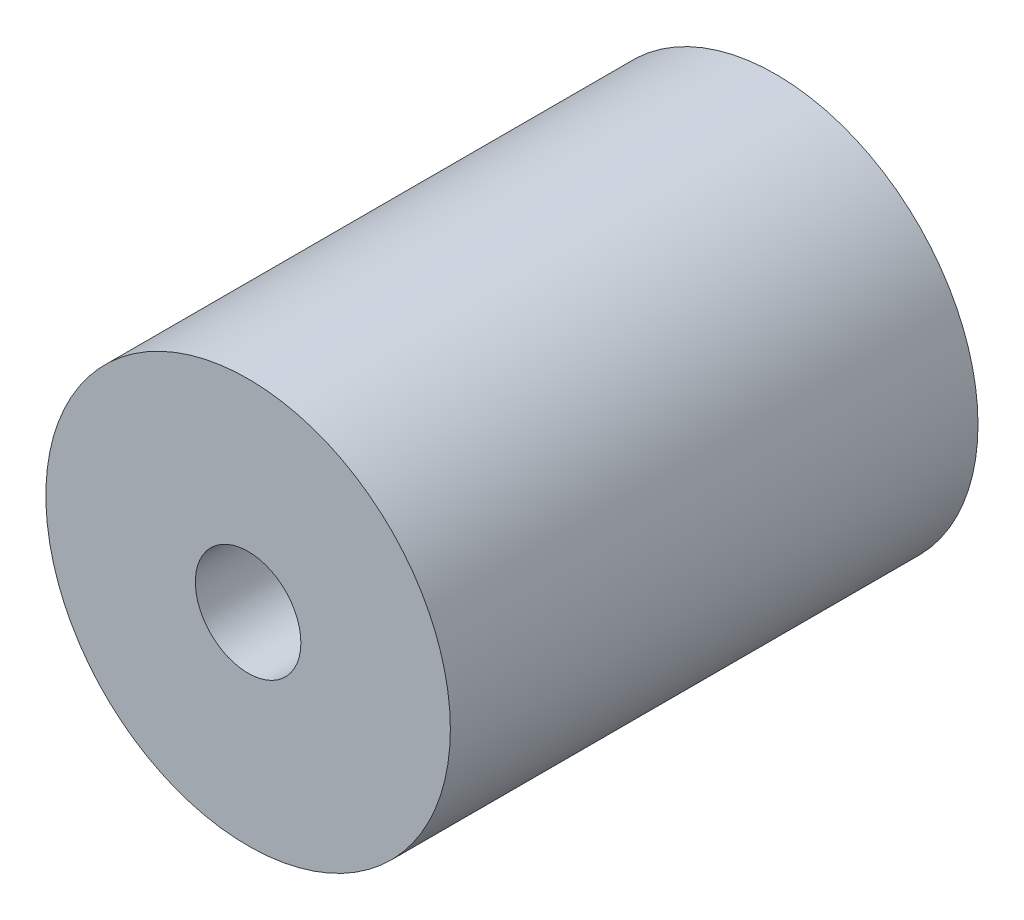
ISO-10303-21;
HEADER;
FILE_DESCRIPTION(('STEP AP214'),'2;1');
FILE_NAME('part.step','',(''),(''),'','','');
FILE_SCHEMA(('AUTOMOTIVE_DESIGN { 1 0 10303 214 1 1 1 1 }'));
ENDSEC;
DATA;
#1=APPLICATION_CONTEXT('core data for automotive mechanical design processes');
#2=APPLICATION_PROTOCOL_DEFINITION('international standard','automotive_design',2000,#1);
#3=PRODUCT_CONTEXT('',#1,'mechanical');
#4=PRODUCT('Part','Part','',(#3));
#5=PRODUCT_RELATED_PRODUCT_CATEGORY('part','',(#4));
#6=PRODUCT_DEFINITION_FORMATION('','',#4);
#7=PRODUCT_DEFINITION_CONTEXT('part definition',#1,'design');
#8=PRODUCT_DEFINITION('design','',#6,#7);
#9=PRODUCT_DEFINITION_SHAPE('','',#8);
#10=(LENGTH_UNIT() NAMED_UNIT(*) SI_UNIT(.MILLI.,.METRE.));
#11=(NAMED_UNIT(*) PLANE_ANGLE_UNIT() SI_UNIT($,.RADIAN.));
#12=(NAMED_UNIT(*) SI_UNIT($,.STERADIAN.) SOLID_ANGLE_UNIT());
#13=UNCERTAINTY_MEASURE_WITH_UNIT(LENGTH_MEASURE(1.E-05),#10,'distance_accuracy_value','');
#14=(GEOMETRIC_REPRESENTATION_CONTEXT(3) GLOBAL_UNCERTAINTY_ASSIGNED_CONTEXT((#13)) GLOBAL_UNIT_ASSIGNED_CONTEXT((#10,
#11,#12)) REPRESENTATION_CONTEXT('',''));
#15=CARTESIAN_POINT('',(0.,0.,0.));
#16=DIRECTION('',(0.,0.,1.));
#17=DIRECTION('',(1.,0.,0.));
#18=AXIS2_PLACEMENT_3D('',#15,#16,#17);
#19=CARTESIAN_POINT('',(0.,0.,30.));
#20=DIRECTION('',(0.,0.,1.));
#21=DIRECTION('',(1.,0.,0.));
#22=AXIS2_PLACEMENT_3D('',#19,#20,#21);
#23=PLANE('',#22);
#24=CARTESIAN_POINT('',(0.,0.,30.));
#25=DIRECTION('',(0.,0.,1.));
#26=DIRECTION('',(1.,0.,0.));
#27=AXIS2_PLACEMENT_3D('',#24,#25,#26);
#28=CIRCLE('',#27,11.5);
#29=CARTESIAN_POINT('',(11.5,0.,30.));
#30=VERTEX_POINT('',#29);
#31=EDGE_CURVE('E10',#30,#30,#28,.T.);
#32=ORIENTED_EDGE('',*,*,#31,.T.);
#33=EDGE_LOOP('',(#32));
#34=FACE_BOUND('',#33,.T.);
#35=CARTESIAN_POINT('',(0.,0.,30.));
#36=DIRECTION('',(0.,0.,1.));
#37=DIRECTION('',(1.,0.,0.));
#38=AXIS2_PLACEMENT_3D('',#35,#36,#37);
#39=CIRCLE('',#38,3.);
#40=CARTESIAN_POINT('',(3.,0.,30.));
#41=VERTEX_POINT('',#40);
#42=EDGE_CURVE('E50',#41,#41,#39,.T.);
#43=ORIENTED_EDGE('',*,*,#42,.F.);
#44=EDGE_LOOP('',(#43));
#45=FACE_BOUND('',#44,.T.);
#46=ADVANCED_FACE('F37',(#34,#45),#23,.T.);
#47=CARTESIAN_POINT('',(0.,0.,0.));
#48=DIRECTION('',(0.,0.,1.));
#49=DIRECTION('',(1.,0.,0.));
#50=AXIS2_PLACEMENT_3D('',#47,#48,#49);
#51=PLANE('',#50);
#52=CARTESIAN_POINT('',(0.,0.,0.));
#53=DIRECTION('',(0.,0.,1.));
#54=DIRECTION('',(1.,0.,0.));
#55=AXIS2_PLACEMENT_3D('',#52,#53,#54);
#56=CIRCLE('',#55,11.5);
#57=CARTESIAN_POINT('',(11.5,0.,0.));
#58=VERTEX_POINT('',#57);
#59=EDGE_CURVE('E41',#58,#58,#56,.T.);
#60=ORIENTED_EDGE('',*,*,#59,.F.);
#61=EDGE_LOOP('',(#60));
#62=FACE_BOUND('',#61,.T.);
#63=CARTESIAN_POINT('',(0.,0.,0.));
#64=DIRECTION('',(0.,0.,1.));
#65=DIRECTION('',(1.,0.,0.));
#66=AXIS2_PLACEMENT_3D('',#63,#64,#65);
#67=CIRCLE('',#66,3.);
#68=CARTESIAN_POINT('',(3.,0.,0.));
#69=VERTEX_POINT('',#68);
#70=EDGE_CURVE('E52',#69,#69,#67,.T.);
#71=ORIENTED_EDGE('',*,*,#70,.T.);
#72=EDGE_LOOP('',(#71));
#73=FACE_BOUND('',#72,.T.);
#74=ADVANCED_FACE('F64',(#62,#73),#51,.F.);
#75=CARTESIAN_POINT('',(0.,0.,30.));
#76=DIRECTION('',(0.,0.,-1.));
#77=DIRECTION('',(-1.,0.,0.));
#78=AXIS2_PLACEMENT_3D('',#75,#76,#77);
#79=CYLINDRICAL_SURFACE('',#78,11.5);
#80=ORIENTED_EDGE('',*,*,#31,.F.);
#81=EDGE_LOOP('',(#80));
#82=FACE_BOUND('',#81,.T.);
#83=ORIENTED_EDGE('',*,*,#59,.T.);
#84=EDGE_LOOP('',(#83));
#85=FACE_BOUND('',#84,.T.);
#86=ADVANCED_FACE('F39',(#82,#85),#79,.T.);
#87=CARTESIAN_POINT('',(0.,0.,30.));
#88=DIRECTION('',(0.,0.,-1.));
#89=DIRECTION('',(-1.,0.,0.));
#90=AXIS2_PLACEMENT_3D('',#87,#88,#89);
#91=CYLINDRICAL_SURFACE('',#90,3.);
#92=ORIENTED_EDGE('',*,*,#42,.T.);
#93=EDGE_LOOP('',(#92));
#94=FACE_BOUND('',#93,.T.);
#95=ORIENTED_EDGE('',*,*,#70,.F.);
#96=EDGE_LOOP('',(#95));
#97=FACE_BOUND('',#96,.T.);
#98=ADVANCED_FACE('F60',(#94,#97),#91,.F.);
#99=CLOSED_SHELL('',(#46,#74,#86,#98));
#100=MANIFOLD_SOLID_BREP('B2',#99);
#101=ADVANCED_BREP_SHAPE_REPRESENTATION('',(#18,#100),#14);
#102=SHAPE_DEFINITION_REPRESENTATION(#9,#101);
ENDSEC;
END-ISO-10303-21;
